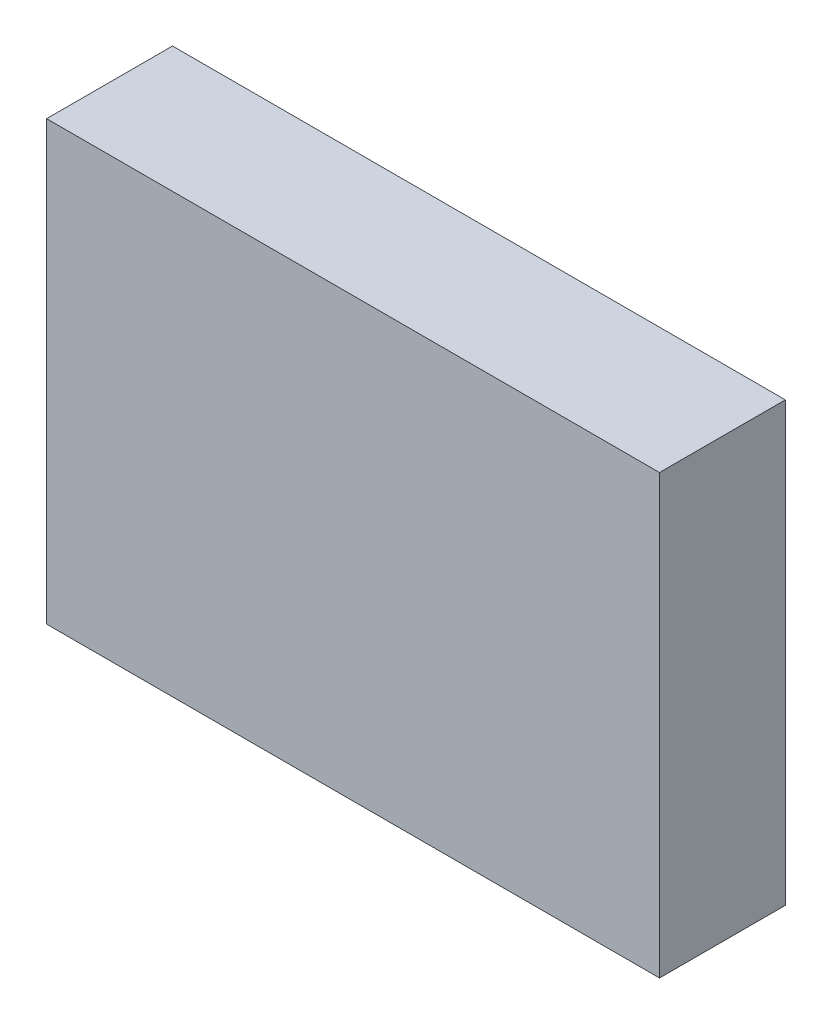
ISO-10303-21;
HEADER;
FILE_DESCRIPTION(('STEP AP214'),'2;1');
FILE_NAME('part.step','',(''),(''),'','','');
FILE_SCHEMA(('AUTOMOTIVE_DESIGN { 1 0 10303 214 1 1 1 1 }'));
ENDSEC;
DATA;
#1=APPLICATION_CONTEXT('core data for automotive mechanical design processes');
#2=APPLICATION_PROTOCOL_DEFINITION('international standard','automotive_design',2000,#1);
#3=PRODUCT_CONTEXT('',#1,'mechanical');
#4=PRODUCT('Part','Part','',(#3));
#5=PRODUCT_RELATED_PRODUCT_CATEGORY('part','',(#4));
#6=PRODUCT_DEFINITION_FORMATION('','',#4);
#7=PRODUCT_DEFINITION_CONTEXT('part definition',#1,'design');
#8=PRODUCT_DEFINITION('design','',#6,#7);
#9=PRODUCT_DEFINITION_SHAPE('','',#8);
#10=(LENGTH_UNIT() NAMED_UNIT(*) SI_UNIT(.MILLI.,.METRE.));
#11=(NAMED_UNIT(*) PLANE_ANGLE_UNIT() SI_UNIT($,.RADIAN.));
#12=(NAMED_UNIT(*) SI_UNIT($,.STERADIAN.) SOLID_ANGLE_UNIT());
#13=UNCERTAINTY_MEASURE_WITH_UNIT(LENGTH_MEASURE(1.E-05),#10,'distance_accuracy_value','');
#14=(GEOMETRIC_REPRESENTATION_CONTEXT(3) GLOBAL_UNCERTAINTY_ASSIGNED_CONTEXT((#13)) GLOBAL_UNIT_ASSIGNED_CONTEXT((#10,
#11,#12)) REPRESENTATION_CONTEXT('',''));
#15=CARTESIAN_POINT('',(0.,0.,0.));
#16=DIRECTION('',(0.,0.,1.));
#17=DIRECTION('',(1.,0.,0.));
#18=AXIS2_PLACEMENT_3D('',#15,#16,#17);
#19=CARTESIAN_POINT('',(44.45,-31.75,9.128125));
#20=DIRECTION('',(-1.,0.,0.));
#21=DIRECTION('',(0.,0.,1.));
#22=AXIS2_PLACEMENT_3D('',#19,#20,#21);
#23=PLANE('',#22);
#24=DIRECTION('',(0.,1.,0.));
#25=VECTOR('',#24,1.);
#26=CARTESIAN_POINT('',(44.45,-31.75,-9.128125));
#27=LINE('',#26,#25);
#28=CARTESIAN_POINT('',(44.45,-31.75,-9.128125));
#29=VERTEX_POINT('',#28);
#30=CARTESIAN_POINT('',(44.45,31.75,-9.128125));
#31=VERTEX_POINT('',#30);
#32=EDGE_CURVE('E96',#29,#31,#27,.T.);
#33=ORIENTED_EDGE('',*,*,#32,.T.);
#34=DIRECTION('',(0.,0.,-1.));
#35=VECTOR('',#34,1.);
#36=CARTESIAN_POINT('',(44.45,31.75,9.128125));
#37=LINE('',#36,#35);
#38=CARTESIAN_POINT('',(44.45,31.75,9.128125));
#39=VERTEX_POINT('',#38);
#40=EDGE_CURVE('E11',#39,#31,#37,.T.);
#41=ORIENTED_EDGE('',*,*,#40,.F.);
#42=DIRECTION('',(0.,1.,0.));
#43=VECTOR('',#42,1.);
#44=CARTESIAN_POINT('',(44.45,-31.75,9.128125));
#45=LINE('',#44,#43);
#46=CARTESIAN_POINT('',(44.45,-31.75,9.128125));
#47=VERTEX_POINT('',#46);
#48=EDGE_CURVE('E84',#47,#39,#45,.T.);
#49=ORIENTED_EDGE('',*,*,#48,.F.);
#50=DIRECTION('',(0.,0.,-1.));
#51=VECTOR('',#50,1.);
#52=CARTESIAN_POINT('',(44.45,-31.75,9.128125));
#53=LINE('',#52,#51);
#54=EDGE_CURVE('E92',#47,#29,#53,.T.);
#55=ORIENTED_EDGE('',*,*,#54,.T.);
#56=EDGE_LOOP('',(#33,#41,#49,#55));
#57=FACE_BOUND('',#56,.T.);
#58=ADVANCED_FACE('F33',(#57),#23,.F.);
#59=CARTESIAN_POINT('',(-44.45,31.75,9.128125));
#60=DIRECTION('',(0.,-1.,0.));
#61=DIRECTION('',(0.,0.,-1.));
#62=AXIS2_PLACEMENT_3D('',#59,#60,#61);
#63=PLANE('',#62);
#64=DIRECTION('',(-1.,0.,0.));
#65=VECTOR('',#64,1.);
#66=CARTESIAN_POINT('',(-44.45,31.75,-9.128125));
#67=LINE('',#66,#65);
#68=CARTESIAN_POINT('',(-44.45,31.75,-9.128125));
#69=VERTEX_POINT('',#68);
#70=EDGE_CURVE('E88',#31,#69,#67,.T.);
#71=ORIENTED_EDGE('',*,*,#70,.T.);
#72=DIRECTION('',(0.,0.,-1.));
#73=VECTOR('',#72,1.);
#74=CARTESIAN_POINT('',(-44.45,31.75,9.128125));
#75=LINE('',#74,#73);
#76=CARTESIAN_POINT('',(-44.45,31.75,9.128125));
#77=VERTEX_POINT('',#76);
#78=EDGE_CURVE('E41',#77,#69,#75,.T.);
#79=ORIENTED_EDGE('',*,*,#78,.F.);
#80=DIRECTION('',(-1.,0.,0.));
#81=VECTOR('',#80,1.);
#82=CARTESIAN_POINT('',(-44.45,31.75,9.128125));
#83=LINE('',#82,#81);
#84=EDGE_CURVE('E79',#39,#77,#83,.T.);
#85=ORIENTED_EDGE('',*,*,#84,.F.);
#86=ORIENTED_EDGE('',*,*,#40,.T.);
#87=EDGE_LOOP('',(#71,#79,#85,#86));
#88=FACE_BOUND('',#87,.T.);
#89=ADVANCED_FACE('F87',(#88),#63,.F.);
#90=CARTESIAN_POINT('',(-44.45,-31.75,9.128125));
#91=DIRECTION('',(1.,0.,0.));
#92=DIRECTION('',(0.,0.,-1.));
#93=AXIS2_PLACEMENT_3D('',#90,#91,#92);
#94=PLANE('',#93);
#95=DIRECTION('',(0.,-1.,0.));
#96=VECTOR('',#95,1.);
#97=CARTESIAN_POINT('',(-44.45,-31.75,-9.128125));
#98=LINE('',#97,#96);
#99=CARTESIAN_POINT('',(-44.45,-31.75,-9.128125));
#100=VERTEX_POINT('',#99);
#101=EDGE_CURVE('E66',#69,#100,#98,.T.);
#102=ORIENTED_EDGE('',*,*,#101,.T.);
#103=DIRECTION('',(0.,0.,-1.));
#104=VECTOR('',#103,1.);
#105=CARTESIAN_POINT('',(-44.45,-31.75,9.128125));
#106=LINE('',#105,#104);
#107=CARTESIAN_POINT('',(-44.45,-31.75,9.128125));
#108=VERTEX_POINT('',#107);
#109=EDGE_CURVE('E89',#108,#100,#106,.T.);
#110=ORIENTED_EDGE('',*,*,#109,.F.);
#111=DIRECTION('',(0.,-1.,0.));
#112=VECTOR('',#111,1.);
#113=CARTESIAN_POINT('',(-44.45,-31.75,9.128125));
#114=LINE('',#113,#112);
#115=EDGE_CURVE('E82',#77,#108,#114,.T.);
#116=ORIENTED_EDGE('',*,*,#115,.F.);
#117=ORIENTED_EDGE('',*,*,#78,.T.);
#118=EDGE_LOOP('',(#102,#110,#116,#117));
#119=FACE_BOUND('',#118,.T.);
#120=ADVANCED_FACE('F90',(#119),#94,.F.);
#121=CARTESIAN_POINT('',(-44.45,-31.75,9.128125));
#122=DIRECTION('',(0.,1.,0.));
#123=DIRECTION('',(0.,0.,1.));
#124=AXIS2_PLACEMENT_3D('',#121,#122,#123);
#125=PLANE('',#124);
#126=DIRECTION('',(1.,0.,0.));
#127=VECTOR('',#126,1.);
#128=CARTESIAN_POINT('',(-44.45,-31.75,-9.128125));
#129=LINE('',#128,#127);
#130=EDGE_CURVE('E72',#100,#29,#129,.T.);
#131=ORIENTED_EDGE('',*,*,#130,.T.);
#132=ORIENTED_EDGE('',*,*,#54,.F.);
#133=DIRECTION('',(1.,0.,0.));
#134=VECTOR('',#133,1.);
#135=CARTESIAN_POINT('',(-44.45,-31.75,9.128125));
#136=LINE('',#135,#134);
#137=EDGE_CURVE('E49',#108,#47,#136,.T.);
#138=ORIENTED_EDGE('',*,*,#137,.F.);
#139=ORIENTED_EDGE('',*,*,#109,.T.);
#140=EDGE_LOOP('',(#131,#132,#138,#139));
#141=FACE_BOUND('',#140,.T.);
#142=ADVANCED_FACE('F103',(#141),#125,.F.);
#143=CARTESIAN_POINT('',(0.,0.,9.128125));
#144=DIRECTION('',(0.,0.,-1.));
#145=DIRECTION('',(-1.,0.,0.));
#146=AXIS2_PLACEMENT_3D('',#143,#144,#145);
#147=PLANE('',#146);
#148=ORIENTED_EDGE('',*,*,#48,.T.);
#149=ORIENTED_EDGE('',*,*,#84,.T.);
#150=ORIENTED_EDGE('',*,*,#115,.T.);
#151=ORIENTED_EDGE('',*,*,#137,.T.);
#152=EDGE_LOOP('',(#148,#149,#150,#151));
#153=FACE_BOUND('',#152,.T.);
#154=ADVANCED_FACE('F80',(#153),#147,.F.);
#155=CARTESIAN_POINT('',(0.,0.,-9.128125));
#156=DIRECTION('',(0.,0.,-1.));
#157=DIRECTION('',(-1.,0.,0.));
#158=AXIS2_PLACEMENT_3D('',#155,#156,#157);
#159=PLANE('',#158);
#160=ORIENTED_EDGE('',*,*,#32,.F.);
#161=ORIENTED_EDGE('',*,*,#130,.F.);
#162=ORIENTED_EDGE('',*,*,#101,.F.);
#163=ORIENTED_EDGE('',*,*,#70,.F.);
#164=EDGE_LOOP('',(#160,#161,#162,#163));
#165=FACE_BOUND('',#164,.T.);
#166=ADVANCED_FACE('F106',(#165),#159,.T.);
#167=CLOSED_SHELL('',(#58,#89,#120,#142,#154,#166));
#168=MANIFOLD_SOLID_BREP('B2',#167);
#169=ADVANCED_BREP_SHAPE_REPRESENTATION('',(#18,#168),#14);
#170=SHAPE_DEFINITION_REPRESENTATION(#9,#169);
ENDSEC;
END-ISO-10303-21;
